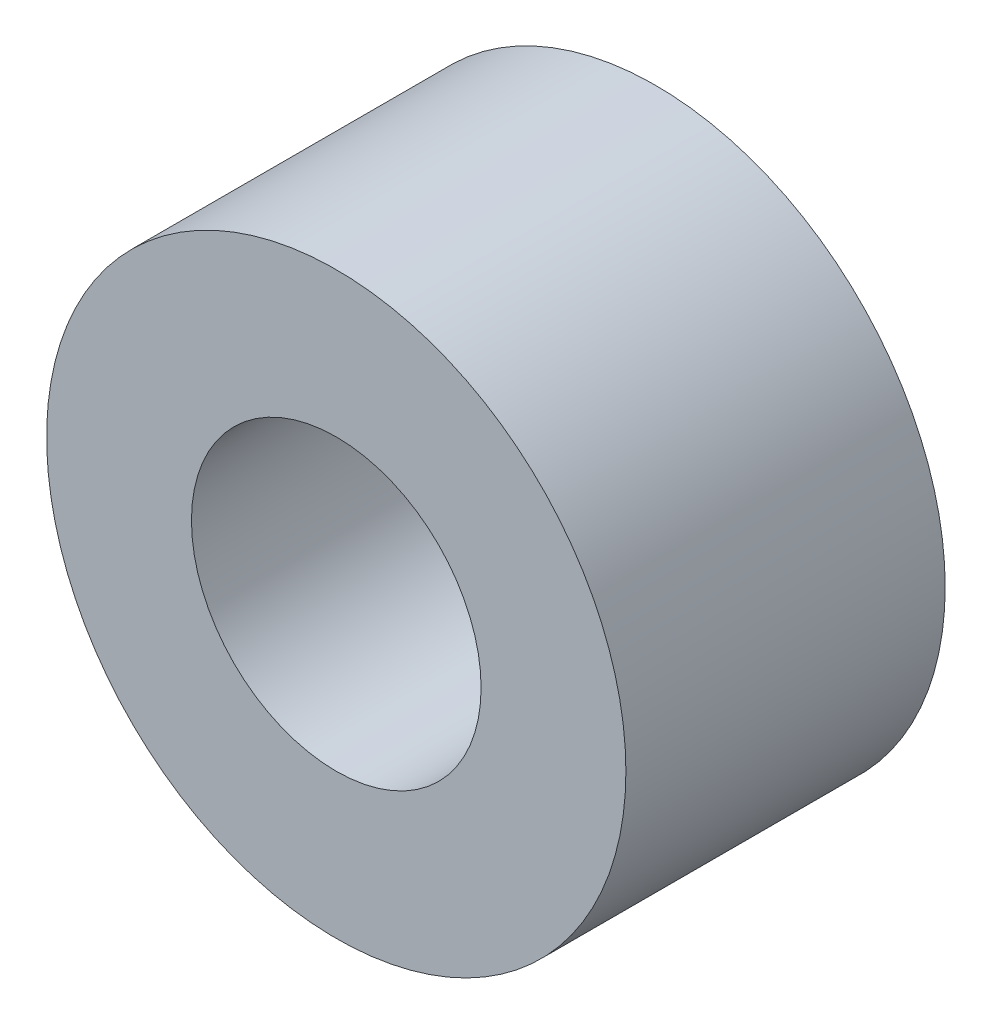
ISO-10303-21;
HEADER;
FILE_DESCRIPTION(('STEP AP214'),'2;1');
FILE_NAME('part.step','',(''),(''),'','','');
FILE_SCHEMA(('AUTOMOTIVE_DESIGN { 1 0 10303 214 1 1 1 1 }'));
ENDSEC;
DATA;
#1=APPLICATION_CONTEXT('core data for automotive mechanical design processes');
#2=APPLICATION_PROTOCOL_DEFINITION('international standard','automotive_design',2000,#1);
#3=PRODUCT_CONTEXT('',#1,'mechanical');
#4=PRODUCT('Part','Part','',(#3));
#5=PRODUCT_RELATED_PRODUCT_CATEGORY('part','',(#4));
#6=PRODUCT_DEFINITION_FORMATION('','',#4);
#7=PRODUCT_DEFINITION_CONTEXT('part definition',#1,'design');
#8=PRODUCT_DEFINITION('design','',#6,#7);
#9=PRODUCT_DEFINITION_SHAPE('','',#8);
#10=(LENGTH_UNIT() NAMED_UNIT(*) SI_UNIT(.MILLI.,.METRE.));
#11=(NAMED_UNIT(*) PLANE_ANGLE_UNIT() SI_UNIT($,.RADIAN.));
#12=(NAMED_UNIT(*) SI_UNIT($,.STERADIAN.) SOLID_ANGLE_UNIT());
#13=UNCERTAINTY_MEASURE_WITH_UNIT(LENGTH_MEASURE(1.E-05),#10,'distance_accuracy_value','');
#14=(GEOMETRIC_REPRESENTATION_CONTEXT(3) GLOBAL_UNCERTAINTY_ASSIGNED_CONTEXT((#13)) GLOBAL_UNIT_ASSIGNED_CONTEXT((#10,
#11,#12)) REPRESENTATION_CONTEXT('',''));
#15=CARTESIAN_POINT('',(0.,0.,0.));
#16=DIRECTION('',(0.,0.,1.));
#17=DIRECTION('',(1.,0.,0.));
#18=AXIS2_PLACEMENT_3D('',#15,#16,#17);
#19=CARTESIAN_POINT('',(0.,0.,7.));
#20=DIRECTION('',(0.,0.,1.));
#21=DIRECTION('',(1.,0.,0.));
#22=AXIS2_PLACEMENT_3D('',#19,#20,#21);
#23=PLANE('',#22);
#24=CARTESIAN_POINT('',(0.,0.,7.));
#25=DIRECTION('',(0.,0.,1.));
#26=DIRECTION('',(1.,0.,0.));
#27=AXIS2_PLACEMENT_3D('',#24,#25,#26);
#28=CIRCLE('',#27,6.35);
#29=CARTESIAN_POINT('',(6.35,0.,7.));
#30=VERTEX_POINT('',#29);
#31=EDGE_CURVE('E10',#30,#30,#28,.T.);
#32=ORIENTED_EDGE('',*,*,#31,.T.);
#33=EDGE_LOOP('',(#32));
#34=FACE_BOUND('',#33,.T.);
#35=CARTESIAN_POINT('',(0.,0.,7.));
#36=DIRECTION('',(0.,0.,1.));
#37=DIRECTION('',(1.,0.,0.));
#38=AXIS2_PLACEMENT_3D('',#35,#36,#37);
#39=CIRCLE('',#38,3.175);
#40=CARTESIAN_POINT('',(3.175,0.,7.));
#41=VERTEX_POINT('',#40);
#42=EDGE_CURVE('E47',#41,#41,#39,.T.);
#43=ORIENTED_EDGE('',*,*,#42,.F.);
#44=EDGE_LOOP('',(#43));
#45=FACE_BOUND('',#44,.T.);
#46=ADVANCED_FACE('F36',(#34,#45),#23,.T.);
#47=CARTESIAN_POINT('',(0.,0.,0.));
#48=DIRECTION('',(0.,0.,1.));
#49=DIRECTION('',(1.,0.,0.));
#50=AXIS2_PLACEMENT_3D('',#47,#48,#49);
#51=PLANE('',#50);
#52=CARTESIAN_POINT('',(0.,0.,0.));
#53=DIRECTION('',(0.,0.,1.));
#54=DIRECTION('',(1.,0.,0.));
#55=AXIS2_PLACEMENT_3D('',#52,#53,#54);
#56=CIRCLE('',#55,6.35);
#57=CARTESIAN_POINT('',(6.35,0.,0.));
#58=VERTEX_POINT('',#57);
#59=EDGE_CURVE('E40',#58,#58,#56,.T.);
#60=ORIENTED_EDGE('',*,*,#59,.F.);
#61=EDGE_LOOP('',(#60));
#62=FACE_BOUND('',#61,.T.);
#63=CARTESIAN_POINT('',(0.,0.,0.));
#64=DIRECTION('',(0.,0.,1.));
#65=DIRECTION('',(1.,0.,0.));
#66=AXIS2_PLACEMENT_3D('',#63,#64,#65);
#67=CIRCLE('',#66,3.175);
#68=CARTESIAN_POINT('',(3.175,0.,0.));
#69=VERTEX_POINT('',#68);
#70=EDGE_CURVE('E49',#69,#69,#67,.T.);
#71=ORIENTED_EDGE('',*,*,#70,.T.);
#72=EDGE_LOOP('',(#71));
#73=FACE_BOUND('',#72,.T.);
#74=ADVANCED_FACE('F59',(#62,#73),#51,.F.);
#75=CARTESIAN_POINT('',(0.,0.,7.));
#76=DIRECTION('',(0.,0.,-1.));
#77=DIRECTION('',(-1.,0.,0.));
#78=AXIS2_PLACEMENT_3D('',#75,#76,#77);
#79=CYLINDRICAL_SURFACE('',#78,6.35);
#80=ORIENTED_EDGE('',*,*,#31,.F.);
#81=EDGE_LOOP('',(#80));
#82=FACE_BOUND('',#81,.T.);
#83=ORIENTED_EDGE('',*,*,#59,.T.);
#84=EDGE_LOOP('',(#83));
#85=FACE_BOUND('',#84,.T.);
#86=ADVANCED_FACE('F38',(#82,#85),#79,.T.);
#87=CARTESIAN_POINT('',(0.,0.,7.));
#88=DIRECTION('',(0.,0.,-1.));
#89=DIRECTION('',(-1.,0.,0.));
#90=AXIS2_PLACEMENT_3D('',#87,#88,#89);
#91=CYLINDRICAL_SURFACE('',#90,3.175);
#92=ORIENTED_EDGE('',*,*,#42,.T.);
#93=EDGE_LOOP('',(#92));
#94=FACE_BOUND('',#93,.T.);
#95=ORIENTED_EDGE('',*,*,#70,.F.);
#96=EDGE_LOOP('',(#95));
#97=FACE_BOUND('',#96,.T.);
#98=ADVANCED_FACE('F55',(#94,#97),#91,.F.);
#99=CLOSED_SHELL('',(#46,#74,#86,#98));
#100=MANIFOLD_SOLID_BREP('B2',#99);
#101=ADVANCED_BREP_SHAPE_REPRESENTATION('',(#18,#100),#14);
#102=SHAPE_DEFINITION_REPRESENTATION(#9,#101);
ENDSEC;
END-ISO-10303-21;
